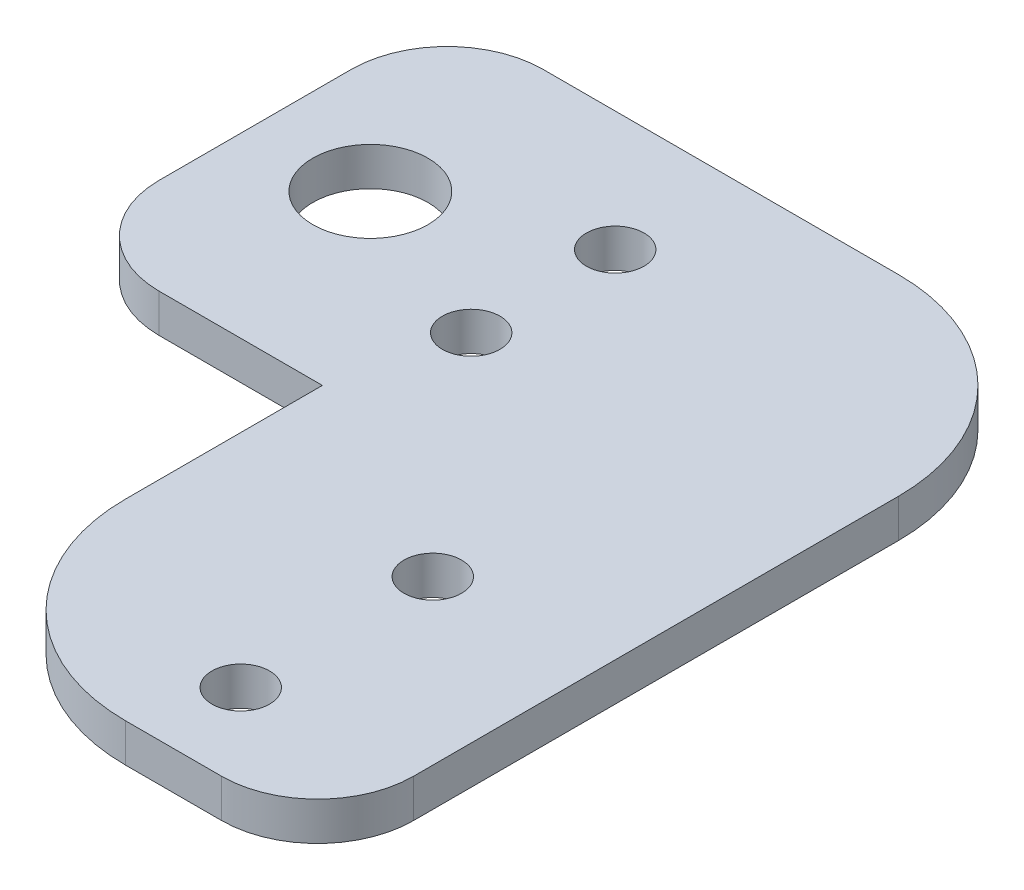
ISO-10303-21;
HEADER;
FILE_DESCRIPTION(('STEP AP214'),'2;1');
FILE_NAME('part.step','',(''),(''),'','','');
FILE_SCHEMA(('AUTOMOTIVE_DESIGN { 1 0 10303 214 1 1 1 1 }'));
ENDSEC;
DATA;
#1=APPLICATION_CONTEXT('core data for automotive mechanical design processes');
#2=APPLICATION_PROTOCOL_DEFINITION('international standard','automotive_design',2000,#1);
#3=PRODUCT_CONTEXT('',#1,'mechanical');
#4=PRODUCT('Part','Part','',(#3));
#5=PRODUCT_RELATED_PRODUCT_CATEGORY('part','',(#4));
#6=PRODUCT_DEFINITION_FORMATION('','',#4);
#7=PRODUCT_DEFINITION_CONTEXT('part definition',#1,'design');
#8=PRODUCT_DEFINITION('design','',#6,#7);
#9=PRODUCT_DEFINITION_SHAPE('','',#8);
#10=(LENGTH_UNIT() NAMED_UNIT(*) SI_UNIT(.MILLI.,.METRE.));
#11=(NAMED_UNIT(*) PLANE_ANGLE_UNIT() SI_UNIT($,.RADIAN.));
#12=(NAMED_UNIT(*) SI_UNIT($,.STERADIAN.) SOLID_ANGLE_UNIT());
#13=UNCERTAINTY_MEASURE_WITH_UNIT(LENGTH_MEASURE(1.E-05),#10,'distance_accuracy_value','');
#14=(GEOMETRIC_REPRESENTATION_CONTEXT(3) GLOBAL_UNCERTAINTY_ASSIGNED_CONTEXT((#13)) GLOBAL_UNIT_ASSIGNED_CONTEXT((#10,
#11,#12)) REPRESENTATION_CONTEXT('',''));
#15=CARTESIAN_POINT('',(0.,0.,0.));
#16=DIRECTION('',(0.,0.,1.));
#17=DIRECTION('',(1.,0.,0.));
#18=AXIS2_PLACEMENT_3D('',#15,#16,#17);
#19=CARTESIAN_POINT('',(-12.5,2.,-10.));
#20=DIRECTION('',(0.,0.,1.));
#21=DIRECTION('',(1.,0.,0.));
#22=AXIS2_PLACEMENT_3D('',#19,#20,#21);
#23=PLANE('',#22);
#24=DIRECTION('',(-1.,0.,0.));
#25=VECTOR('',#24,1.);
#26=CARTESIAN_POINT('',(-12.5,0.,-10.));
#27=LINE('',#26,#25);
#28=CARTESIAN_POINT('',(11.,0.,-10.));
#29=VERTEX_POINT('',#28);
#30=CARTESIAN_POINT('',(-7.5,0.,-10.));
#31=VERTEX_POINT('',#30);
#32=EDGE_CURVE('E180',#29,#31,#27,.T.);
#33=ORIENTED_EDGE('',*,*,#32,.T.);
#34=DIRECTION('',(0.,-1.,0.));
#35=VECTOR('',#34,1.);
#36=CARTESIAN_POINT('',(-7.5,2.,-10.));
#37=LINE('',#36,#35);
#38=CARTESIAN_POINT('',(-7.5,2.,-10.));
#39=VERTEX_POINT('',#38);
#40=EDGE_CURVE('E241',#31,#39,#37,.F.);
#41=ORIENTED_EDGE('',*,*,#40,.T.);
#42=DIRECTION('',(-1.,0.,0.));
#43=VECTOR('',#42,1.);
#44=CARTESIAN_POINT('',(-12.5,2.,-10.));
#45=LINE('',#44,#43);
#46=CARTESIAN_POINT('',(11.,2.,-10.));
#47=VERTEX_POINT('',#46);
#48=EDGE_CURVE('E187',#47,#39,#45,.T.);
#49=ORIENTED_EDGE('',*,*,#48,.F.);
#50=DIRECTION('',(0.,1.,0.));
#51=VECTOR('',#50,1.);
#52=CARTESIAN_POINT('',(11.,0.,-10.));
#53=LINE('',#52,#51);
#54=EDGE_CURVE('E210',#47,#29,#53,.F.);
#55=ORIENTED_EDGE('',*,*,#54,.T.);
#56=EDGE_LOOP('',(#33,#41,#49,#55));
#57=FACE_BOUND('',#56,.T.);
#58=ADVANCED_FACE('F39',(#57),#23,.F.);
#59=CARTESIAN_POINT('',(-12.5,2.,-10.));
#60=DIRECTION('',(1.,0.,0.));
#61=DIRECTION('',(0.,0.,-1.));
#62=AXIS2_PLACEMENT_3D('',#59,#60,#61);
#63=PLANE('',#62);
#64=DIRECTION('',(0.,0.,1.));
#65=VECTOR('',#64,1.);
#66=CARTESIAN_POINT('',(-12.5,2.,-10.));
#67=LINE('',#66,#65);
#68=CARTESIAN_POINT('',(-12.5,2.,-5.));
#69=VERTEX_POINT('',#68);
#70=CARTESIAN_POINT('',(-12.5,2.,5.));
#71=VERTEX_POINT('',#70);
#72=EDGE_CURVE('E134',#69,#71,#67,.T.);
#73=ORIENTED_EDGE('',*,*,#72,.F.);
#74=DIRECTION('',(0.,-1.,0.));
#75=VECTOR('',#74,1.);
#76=CARTESIAN_POINT('',(-12.5,2.,-5.));
#77=LINE('',#76,#75);
#78=CARTESIAN_POINT('',(-12.5,0.,-5.));
#79=VERTEX_POINT('',#78);
#80=EDGE_CURVE('E228',#69,#79,#77,.T.);
#81=ORIENTED_EDGE('',*,*,#80,.T.);
#82=DIRECTION('',(0.,0.,1.));
#83=VECTOR('',#82,1.);
#84=CARTESIAN_POINT('',(-12.5,0.,-10.));
#85=LINE('',#84,#83);
#86=CARTESIAN_POINT('',(-12.5,0.,5.));
#87=VERTEX_POINT('',#86);
#88=EDGE_CURVE('E195',#79,#87,#85,.T.);
#89=ORIENTED_EDGE('',*,*,#88,.T.);
#90=DIRECTION('',(0.,-1.,0.));
#91=VECTOR('',#90,1.);
#92=CARTESIAN_POINT('',(-12.5,2.,5.));
#93=LINE('',#92,#91);
#94=EDGE_CURVE('E225',#87,#71,#93,.F.);
#95=ORIENTED_EDGE('',*,*,#94,.T.);
#96=EDGE_LOOP('',(#73,#81,#89,#95));
#97=FACE_BOUND('',#96,.T.);
#98=ADVANCED_FACE('F328',(#97),#63,.F.);
#99=CARTESIAN_POINT('',(-12.5,2.,10.));
#100=DIRECTION('',(0.,0.,-1.));
#101=DIRECTION('',(-1.,0.,0.));
#102=AXIS2_PLACEMENT_3D('',#99,#100,#101);
#103=PLANE('',#102);
#104=DIRECTION('',(1.,0.,0.));
#105=VECTOR('',#104,1.);
#106=CARTESIAN_POINT('',(-12.5,2.,10.));
#107=LINE('',#106,#105);
#108=CARTESIAN_POINT('',(-7.5,2.,10.));
#109=VERTEX_POINT('',#108);
#110=CARTESIAN_POINT('',(0.999999999999997,2.,10.));
#111=VERTEX_POINT('',#110);
#112=EDGE_CURVE('E122',#109,#111,#107,.T.);
#113=ORIENTED_EDGE('',*,*,#112,.F.);
#114=DIRECTION('',(0.,-1.,0.));
#115=VECTOR('',#114,1.);
#116=CARTESIAN_POINT('',(-7.5,2.,10.));
#117=LINE('',#116,#115);
#118=CARTESIAN_POINT('',(-7.5,0.,10.));
#119=VERTEX_POINT('',#118);
#120=EDGE_CURVE('E251',#109,#119,#117,.T.);
#121=ORIENTED_EDGE('',*,*,#120,.T.);
#122=DIRECTION('',(1.,0.,0.));
#123=VECTOR('',#122,1.);
#124=CARTESIAN_POINT('',(-12.5,0.,10.));
#125=LINE('',#124,#123);
#126=CARTESIAN_POINT('',(0.999999999999997,0.,10.));
#127=VERTEX_POINT('',#126);
#128=EDGE_CURVE('E151',#119,#127,#125,.T.);
#129=ORIENTED_EDGE('',*,*,#128,.T.);
#130=DIRECTION('',(0.,1.,0.));
#131=VECTOR('',#130,1.);
#132=CARTESIAN_POINT('',(0.999999999999997,2.,10.));
#133=LINE('',#132,#131);
#134=EDGE_CURVE('E141',#127,#111,#133,.T.);
#135=ORIENTED_EDGE('',*,*,#134,.T.);
#136=EDGE_LOOP('',(#113,#121,#129,#135));
#137=FACE_BOUND('',#136,.T.);
#138=ADVANCED_FACE('F149',(#137),#103,.F.);
#139=CARTESIAN_POINT('',(0.,2.,0.));
#140=DIRECTION('',(0.,1.,0.));
#141=DIRECTION('',(0.,0.,1.));
#142=AXIS2_PLACEMENT_3D('',#139,#140,#141);
#143=PLANE('',#142);
#144=ORIENTED_EDGE('',*,*,#48,.T.);
#145=CARTESIAN_POINT('',(-7.5,2.,-5.));
#146=DIRECTION('',(0.,1.,0.));
#147=DIRECTION('',(0.,0.,1.));
#148=AXIS2_PLACEMENT_3D('',#145,#146,#147);
#149=CIRCLE('',#148,5.);
#150=EDGE_CURVE('E248',#39,#69,#149,.T.);
#151=ORIENTED_EDGE('',*,*,#150,.T.);
#152=ORIENTED_EDGE('',*,*,#72,.T.);
#153=CARTESIAN_POINT('',(-7.5,2.,5.));
#154=DIRECTION('',(0.,1.,0.));
#155=DIRECTION('',(0.,0.,1.));
#156=AXIS2_PLACEMENT_3D('',#153,#154,#155);
#157=CIRCLE('',#156,5.);
#158=EDGE_CURVE('E63',#71,#109,#157,.T.);
#159=ORIENTED_EDGE('',*,*,#158,.T.);
#160=ORIENTED_EDGE('',*,*,#112,.T.);
#161=DIRECTION('',(0.,0.,1.));
#162=VECTOR('',#161,1.);
#163=CARTESIAN_POINT('',(0.999999999999998,2.,30.25));
#164=LINE('',#163,#162);
#165=CARTESIAN_POINT('',(0.999999999999998,2.,20.25));
#166=VERTEX_POINT('',#165);
#167=EDGE_CURVE('E127',#111,#166,#164,.T.);
#168=ORIENTED_EDGE('',*,*,#167,.T.);
#169=CARTESIAN_POINT('',(11.,2.,20.25));
#170=DIRECTION('',(0.,1.,0.));
#171=DIRECTION('',(0.,0.,1.));
#172=AXIS2_PLACEMENT_3D('',#169,#170,#171);
#173=CIRCLE('',#172,10.);
#174=CARTESIAN_POINT('',(11.,2.,30.25));
#175=VERTEX_POINT('',#174);
#176=EDGE_CURVE('E204',#166,#175,#173,.T.);
#177=ORIENTED_EDGE('',*,*,#176,.T.);
#178=DIRECTION('',(1.,0.,0.));
#179=VECTOR('',#178,1.);
#180=CARTESIAN_POINT('',(21.,2.,30.25));
#181=LINE('',#180,#179);
#182=CARTESIAN_POINT('',(16.,2.,30.25));
#183=VERTEX_POINT('',#182);
#184=EDGE_CURVE('E146',#175,#183,#181,.T.);
#185=ORIENTED_EDGE('',*,*,#184,.T.);
#186=CARTESIAN_POINT('',(16.,2.,25.25));
#187=DIRECTION('',(0.,1.,0.));
#188=DIRECTION('',(0.,0.,1.));
#189=AXIS2_PLACEMENT_3D('',#186,#187,#188);
#190=CIRCLE('',#189,5.);
#191=CARTESIAN_POINT('',(21.,2.,25.25));
#192=VERTEX_POINT('',#191);
#193=EDGE_CURVE('E55',#183,#192,#190,.T.);
#194=ORIENTED_EDGE('',*,*,#193,.T.);
#195=DIRECTION('',(0.,0.,-1.));
#196=VECTOR('',#195,1.);
#197=CARTESIAN_POINT('',(21.,2.,30.25));
#198=LINE('',#197,#196);
#199=CARTESIAN_POINT('',(21.,2.,0.));
#200=VERTEX_POINT('',#199);
#201=EDGE_CURVE('E165',#192,#200,#198,.T.);
#202=ORIENTED_EDGE('',*,*,#201,.T.);
#203=CARTESIAN_POINT('',(11.,2.,0.));
#204=DIRECTION('',(0.,1.,0.));
#205=DIRECTION('',(0.,0.,1.));
#206=AXIS2_PLACEMENT_3D('',#203,#204,#205);
#207=CIRCLE('',#206,10.);
#208=EDGE_CURVE('E207',#200,#47,#207,.T.);
#209=ORIENTED_EDGE('',*,*,#208,.T.);
#210=EDGE_LOOP('',(#144,#151,#152,#159,#160,#168,#177,#185,#194,#202,#209));
#211=FACE_BOUND('',#210,.T.);
#212=CARTESIAN_POINT('',(12.5,2.,15.75));
#213=DIRECTION('',(0.,1.,0.));
#214=DIRECTION('',(0.,0.,1.));
#215=AXIS2_PLACEMENT_3D('',#212,#213,#214);
#216=CIRCLE('',#215,1.5);
#217=CARTESIAN_POINT('',(12.5,2.,17.25));
#218=VERTEX_POINT('',#217);
#219=EDGE_CURVE('E279',#218,#218,#216,.T.);
#220=ORIENTED_EDGE('',*,*,#219,.F.);
#221=EDGE_LOOP('',(#220));
#222=FACE_BOUND('',#221,.T.);
#223=CARTESIAN_POINT('',(12.5,2.,25.75));
#224=DIRECTION('',(0.,1.,0.));
#225=DIRECTION('',(0.,0.,1.));
#226=AXIS2_PLACEMENT_3D('',#223,#224,#225);
#227=CIRCLE('',#226,1.5);
#228=CARTESIAN_POINT('',(12.5,2.,27.25));
#229=VERTEX_POINT('',#228);
#230=EDGE_CURVE('E271',#229,#229,#227,.T.);
#231=ORIENTED_EDGE('',*,*,#230,.F.);
#232=EDGE_LOOP('',(#231));
#233=FACE_BOUND('',#232,.T.);
#234=CARTESIAN_POINT('',(2.5,2.,3.75));
#235=DIRECTION('',(0.,1.,0.));
#236=DIRECTION('',(0.,0.,1.));
#237=AXIS2_PLACEMENT_3D('',#234,#235,#236);
#238=CIRCLE('',#237,1.5);
#239=CARTESIAN_POINT('',(2.5,2.,5.25));
#240=VERTEX_POINT('',#239);
#241=EDGE_CURVE('E169',#240,#240,#238,.T.);
#242=ORIENTED_EDGE('',*,*,#241,.F.);
#243=EDGE_LOOP('',(#242));
#244=FACE_BOUND('',#243,.T.);
#245=CARTESIAN_POINT('',(-6.5,2.,0.));
#246=DIRECTION('',(0.,1.,0.));
#247=DIRECTION('',(0.,0.,1.));
#248=AXIS2_PLACEMENT_3D('',#245,#246,#247);
#249=CIRCLE('',#248,3.);
#250=CARTESIAN_POINT('',(-6.5,2.,3.));
#251=VERTEX_POINT('',#250);
#252=EDGE_CURVE('E153',#251,#251,#249,.F.);
#253=ORIENTED_EDGE('',*,*,#252,.T.);
#254=EDGE_LOOP('',(#253));
#255=FACE_BOUND('',#254,.T.);
#256=CARTESIAN_POINT('',(2.5,2.,-3.75));
#257=DIRECTION('',(0.,1.,0.));
#258=DIRECTION('',(0.,0.,1.));
#259=AXIS2_PLACEMENT_3D('',#256,#257,#258);
#260=CIRCLE('',#259,1.5);
#261=CARTESIAN_POINT('',(2.5,2.,-2.25));
#262=VERTEX_POINT('',#261);
#263=EDGE_CURVE('E171',#262,#262,#260,.T.);
#264=ORIENTED_EDGE('',*,*,#263,.F.);
#265=EDGE_LOOP('',(#264));
#266=FACE_BOUND('',#265,.T.);
#267=ADVANCED_FACE('F125',(#211,#222,#233,#244,#255,#266),#143,.T.);
#268=CARTESIAN_POINT('',(0.,0.,0.));
#269=DIRECTION('',(0.,1.,0.));
#270=DIRECTION('',(0.,0.,1.));
#271=AXIS2_PLACEMENT_3D('',#268,#269,#270);
#272=PLANE('',#271);
#273=ORIENTED_EDGE('',*,*,#88,.F.);
#274=CARTESIAN_POINT('',(-7.5,0.,-5.));
#275=DIRECTION('',(0.,1.,0.));
#276=DIRECTION('',(0.,0.,1.));
#277=AXIS2_PLACEMENT_3D('',#274,#275,#276);
#278=CIRCLE('',#277,5.);
#279=EDGE_CURVE('E238',#79,#31,#278,.F.);
#280=ORIENTED_EDGE('',*,*,#279,.T.);
#281=ORIENTED_EDGE('',*,*,#32,.F.);
#282=CARTESIAN_POINT('',(11.,0.,0.));
#283=DIRECTION('',(0.,1.,0.));
#284=DIRECTION('',(0.,0.,1.));
#285=AXIS2_PLACEMENT_3D('',#282,#283,#284);
#286=CIRCLE('',#285,10.);
#287=CARTESIAN_POINT('',(21.,0.,0.));
#288=VERTEX_POINT('',#287);
#289=EDGE_CURVE('E216',#29,#288,#286,.F.);
#290=ORIENTED_EDGE('',*,*,#289,.T.);
#291=DIRECTION('',(0.,0.,-1.));
#292=VECTOR('',#291,1.);
#293=CARTESIAN_POINT('',(21.,0.,30.25));
#294=LINE('',#293,#292);
#295=CARTESIAN_POINT('',(21.,0.,25.25));
#296=VERTEX_POINT('',#295);
#297=EDGE_CURVE('E154',#296,#288,#294,.T.);
#298=ORIENTED_EDGE('',*,*,#297,.F.);
#299=CARTESIAN_POINT('',(16.,0.,25.25));
#300=DIRECTION('',(0.,1.,0.));
#301=DIRECTION('',(0.,0.,1.));
#302=AXIS2_PLACEMENT_3D('',#299,#300,#301);
#303=CIRCLE('',#302,5.);
#304=CARTESIAN_POINT('',(16.,0.,30.25));
#305=VERTEX_POINT('',#304);
#306=EDGE_CURVE('E232',#296,#305,#303,.F.);
#307=ORIENTED_EDGE('',*,*,#306,.T.);
#308=DIRECTION('',(1.,0.,0.));
#309=VECTOR('',#308,1.);
#310=CARTESIAN_POINT('',(21.,0.,30.25));
#311=LINE('',#310,#309);
#312=CARTESIAN_POINT('',(11.,0.,30.25));
#313=VERTEX_POINT('',#312);
#314=EDGE_CURVE('E161',#313,#305,#311,.T.);
#315=ORIENTED_EDGE('',*,*,#314,.F.);
#316=CARTESIAN_POINT('',(11.,0.,20.25));
#317=DIRECTION('',(0.,1.,0.));
#318=DIRECTION('',(0.,0.,1.));
#319=AXIS2_PLACEMENT_3D('',#316,#317,#318);
#320=CIRCLE('',#319,10.);
#321=CARTESIAN_POINT('',(0.999999999999998,0.,20.25));
#322=VERTEX_POINT('',#321);
#323=EDGE_CURVE('E213',#313,#322,#320,.F.);
#324=ORIENTED_EDGE('',*,*,#323,.T.);
#325=DIRECTION('',(0.,0.,1.));
#326=VECTOR('',#325,1.);
#327=CARTESIAN_POINT('',(0.999999999999998,0.,30.25));
#328=LINE('',#327,#326);
#329=EDGE_CURVE('E265',#127,#322,#328,.T.);
#330=ORIENTED_EDGE('',*,*,#329,.F.);
#331=ORIENTED_EDGE('',*,*,#128,.F.);
#332=CARTESIAN_POINT('',(-7.5,0.,5.));
#333=DIRECTION('',(0.,1.,0.));
#334=DIRECTION('',(0.,0.,1.));
#335=AXIS2_PLACEMENT_3D('',#332,#333,#334);
#336=CIRCLE('',#335,5.);
#337=EDGE_CURVE('E235',#119,#87,#336,.F.);
#338=ORIENTED_EDGE('',*,*,#337,.T.);
#339=EDGE_LOOP('',(#273,#280,#281,#290,#298,#307,#315,#324,#330,#331,#338));
#340=FACE_BOUND('',#339,.T.);
#341=CARTESIAN_POINT('',(12.5,0.,15.75));
#342=DIRECTION('',(0.,1.,0.));
#343=DIRECTION('',(0.,0.,1.));
#344=AXIS2_PLACEMENT_3D('',#341,#342,#343);
#345=CIRCLE('',#344,1.5);
#346=CARTESIAN_POINT('',(12.5,0.,17.25));
#347=VERTEX_POINT('',#346);
#348=EDGE_CURVE('E147',#347,#347,#345,.T.);
#349=ORIENTED_EDGE('',*,*,#348,.T.);
#350=EDGE_LOOP('',(#349));
#351=FACE_BOUND('',#350,.T.);
#352=CARTESIAN_POINT('',(12.5,0.,25.75));
#353=DIRECTION('',(0.,1.,0.));
#354=DIRECTION('',(0.,0.,1.));
#355=AXIS2_PLACEMENT_3D('',#352,#353,#354);
#356=CIRCLE('',#355,1.5);
#357=CARTESIAN_POINT('',(12.5,0.,27.25));
#358=VERTEX_POINT('',#357);
#359=EDGE_CURVE('E275',#358,#358,#356,.T.);
#360=ORIENTED_EDGE('',*,*,#359,.T.);
#361=EDGE_LOOP('',(#360));
#362=FACE_BOUND('',#361,.T.);
#363=CARTESIAN_POINT('',(2.5,0.,3.75));
#364=DIRECTION('',(0.,1.,0.));
#365=DIRECTION('',(0.,0.,1.));
#366=AXIS2_PLACEMENT_3D('',#363,#364,#365);
#367=CIRCLE('',#366,1.5);
#368=CARTESIAN_POINT('',(2.5,0.,5.25));
#369=VERTEX_POINT('',#368);
#370=EDGE_CURVE('E176',#369,#369,#367,.F.);
#371=ORIENTED_EDGE('',*,*,#370,.F.);
#372=EDGE_LOOP('',(#371));
#373=FACE_BOUND('',#372,.T.);
#374=CARTESIAN_POINT('',(-6.5,0.,0.));
#375=DIRECTION('',(0.,-1.,0.));
#376=DIRECTION('',(0.,0.,-1.));
#377=AXIS2_PLACEMENT_3D('',#374,#375,#376);
#378=CIRCLE('',#377,3.);
#379=CARTESIAN_POINT('',(-6.5,0.,-3.));
#380=VERTEX_POINT('',#379);
#381=EDGE_CURVE('E159',#380,#380,#378,.T.);
#382=ORIENTED_EDGE('',*,*,#381,.F.);
#383=EDGE_LOOP('',(#382));
#384=FACE_BOUND('',#383,.T.);
#385=CARTESIAN_POINT('',(2.5,0.,-3.75));
#386=DIRECTION('',(0.,1.,0.));
#387=DIRECTION('',(0.,0.,1.));
#388=AXIS2_PLACEMENT_3D('',#385,#386,#387);
#389=CIRCLE('',#388,1.5);
#390=CARTESIAN_POINT('',(2.5,0.,-2.25));
#391=VERTEX_POINT('',#390);
#392=EDGE_CURVE('E175',#391,#391,#389,.F.);
#393=ORIENTED_EDGE('',*,*,#392,.F.);
#394=EDGE_LOOP('',(#393));
#395=FACE_BOUND('',#394,.T.);
#396=ADVANCED_FACE('F287',(#340,#351,#362,#373,#384,#395),#272,.F.);
#397=CARTESIAN_POINT('',(2.5,-0.00100000000000013,3.75));
#398=DIRECTION('',(0.,1.,0.));
#399=DIRECTION('',(0.,0.,1.));
#400=AXIS2_PLACEMENT_3D('',#397,#398,#399);
#401=CYLINDRICAL_SURFACE('',#400,1.5);
#402=ORIENTED_EDGE('',*,*,#370,.T.);
#403=EDGE_LOOP('',(#402));
#404=FACE_BOUND('',#403,.T.);
#405=ORIENTED_EDGE('',*,*,#241,.T.);
#406=EDGE_LOOP('',(#405));
#407=FACE_BOUND('',#406,.T.);
#408=ADVANCED_FACE('F312',(#404,#407),#401,.F.);
#409=CARTESIAN_POINT('',(2.5,-0.00100000000000013,-3.75));
#410=DIRECTION('',(0.,1.,0.));
#411=DIRECTION('',(0.,0.,1.));
#412=AXIS2_PLACEMENT_3D('',#409,#410,#411);
#413=CYLINDRICAL_SURFACE('',#412,1.5);
#414=ORIENTED_EDGE('',*,*,#263,.T.);
#415=EDGE_LOOP('',(#414));
#416=FACE_BOUND('',#415,.T.);
#417=ORIENTED_EDGE('',*,*,#392,.T.);
#418=EDGE_LOOP('',(#417));
#419=FACE_BOUND('',#418,.T.);
#420=ADVANCED_FACE('F308',(#416,#419),#413,.F.);
#421=CARTESIAN_POINT('',(-6.5,2.001,0.));
#422=DIRECTION('',(0.,-1.,0.));
#423=DIRECTION('',(0.,0.,-1.));
#424=AXIS2_PLACEMENT_3D('',#421,#422,#423);
#425=CYLINDRICAL_SURFACE('',#424,3.);
#426=ORIENTED_EDGE('',*,*,#252,.F.);
#427=EDGE_LOOP('',(#426));
#428=FACE_BOUND('',#427,.T.);
#429=ORIENTED_EDGE('',*,*,#381,.T.);
#430=EDGE_LOOP('',(#429));
#431=FACE_BOUND('',#430,.T.);
#432=ADVANCED_FACE('F311',(#428,#431),#425,.F.);
#433=CARTESIAN_POINT('',(0.999999999999998,0.,30.25));
#434=DIRECTION('',(-1.,0.,0.));
#435=DIRECTION('',(0.,0.,1.));
#436=AXIS2_PLACEMENT_3D('',#433,#434,#435);
#437=PLANE('',#436);
#438=ORIENTED_EDGE('',*,*,#329,.T.);
#439=DIRECTION('',(0.,1.,0.));
#440=VECTOR('',#439,1.);
#441=CARTESIAN_POINT('',(0.999999999999998,0.,20.25));
#442=LINE('',#441,#440);
#443=EDGE_CURVE('E144',#322,#166,#442,.T.);
#444=ORIENTED_EDGE('',*,*,#443,.T.);
#445=ORIENTED_EDGE('',*,*,#167,.F.);
#446=ORIENTED_EDGE('',*,*,#134,.F.);
#447=EDGE_LOOP('',(#438,#444,#445,#446));
#448=FACE_BOUND('',#447,.T.);
#449=ADVANCED_FACE('F140',(#448),#437,.T.);
#450=CARTESIAN_POINT('',(21.,0.,30.25));
#451=DIRECTION('',(1.,0.,0.));
#452=DIRECTION('',(0.,0.,-1.));
#453=AXIS2_PLACEMENT_3D('',#450,#451,#452);
#454=PLANE('',#453);
#455=ORIENTED_EDGE('',*,*,#201,.F.);
#456=DIRECTION('',(0.,1.,0.));
#457=VECTOR('',#456,1.);
#458=CARTESIAN_POINT('',(21.,0.,25.25));
#459=LINE('',#458,#457);
#460=EDGE_CURVE('E11',#192,#296,#459,.F.);
#461=ORIENTED_EDGE('',*,*,#460,.T.);
#462=ORIENTED_EDGE('',*,*,#297,.T.);
#463=DIRECTION('',(0.,1.,0.));
#464=VECTOR('',#463,1.);
#465=CARTESIAN_POINT('',(21.,2.,0.));
#466=LINE('',#465,#464);
#467=EDGE_CURVE('E133',#288,#200,#466,.T.);
#468=ORIENTED_EDGE('',*,*,#467,.T.);
#469=EDGE_LOOP('',(#455,#461,#462,#468));
#470=FACE_BOUND('',#469,.T.);
#471=ADVANCED_FACE('F358',(#470),#454,.T.);
#472=CARTESIAN_POINT('',(21.,0.,30.25));
#473=DIRECTION('',(0.,0.,1.));
#474=DIRECTION('',(1.,0.,0.));
#475=AXIS2_PLACEMENT_3D('',#472,#473,#474);
#476=PLANE('',#475);
#477=ORIENTED_EDGE('',*,*,#314,.T.);
#478=DIRECTION('',(0.,1.,0.));
#479=VECTOR('',#478,1.);
#480=CARTESIAN_POINT('',(16.,0.,30.25));
#481=LINE('',#480,#479);
#482=EDGE_CURVE('E48',#305,#183,#481,.T.);
#483=ORIENTED_EDGE('',*,*,#482,.T.);
#484=ORIENTED_EDGE('',*,*,#184,.F.);
#485=DIRECTION('',(0.,1.,0.));
#486=VECTOR('',#485,1.);
#487=CARTESIAN_POINT('',(11.,0.,30.25));
#488=LINE('',#487,#486);
#489=EDGE_CURVE('E222',#175,#313,#488,.F.);
#490=ORIENTED_EDGE('',*,*,#489,.T.);
#491=EDGE_LOOP('',(#477,#483,#484,#490));
#492=FACE_BOUND('',#491,.T.);
#493=ADVANCED_FACE('F258',(#492),#476,.T.);
#494=CARTESIAN_POINT('',(12.5,0.,25.75));
#495=DIRECTION('',(0.,1.,0.));
#496=DIRECTION('',(0.,0.,1.));
#497=AXIS2_PLACEMENT_3D('',#494,#495,#496);
#498=CYLINDRICAL_SURFACE('',#497,1.5);
#499=ORIENTED_EDGE('',*,*,#359,.F.);
#500=EDGE_LOOP('',(#499));
#501=FACE_BOUND('',#500,.T.);
#502=ORIENTED_EDGE('',*,*,#230,.T.);
#503=EDGE_LOOP('',(#502));
#504=FACE_BOUND('',#503,.T.);
#505=ADVANCED_FACE('F294',(#501,#504),#498,.F.);
#506=CARTESIAN_POINT('',(12.5,0.,15.75));
#507=DIRECTION('',(0.,1.,0.));
#508=DIRECTION('',(0.,0.,1.));
#509=AXIS2_PLACEMENT_3D('',#506,#507,#508);
#510=CYLINDRICAL_SURFACE('',#509,1.5);
#511=ORIENTED_EDGE('',*,*,#348,.F.);
#512=EDGE_LOOP('',(#511));
#513=FACE_BOUND('',#512,.T.);
#514=ORIENTED_EDGE('',*,*,#219,.T.);
#515=EDGE_LOOP('',(#514));
#516=FACE_BOUND('',#515,.T.);
#517=ADVANCED_FACE('F290',(#513,#516),#510,.F.);
#518=CARTESIAN_POINT('',(11.,0.,0.));
#519=DIRECTION('',(0.,-1.,0.));
#520=DIRECTION('',(0.,0.,-1.));
#521=AXIS2_PLACEMENT_3D('',#518,#519,#520);
#522=CYLINDRICAL_SURFACE('',#521,10.);
#523=ORIENTED_EDGE('',*,*,#289,.F.);
#524=ORIENTED_EDGE('',*,*,#54,.F.);
#525=ORIENTED_EDGE('',*,*,#208,.F.);
#526=ORIENTED_EDGE('',*,*,#467,.F.);
#527=EDGE_LOOP('',(#523,#524,#525,#526));
#528=FACE_BOUND('',#527,.T.);
#529=ADVANCED_FACE('F293',(#528),#522,.T.);
#530=CARTESIAN_POINT('',(11.,0.,20.25));
#531=DIRECTION('',(0.,1.,0.));
#532=DIRECTION('',(0.,0.,1.));
#533=AXIS2_PLACEMENT_3D('',#530,#531,#532);
#534=CYLINDRICAL_SURFACE('',#533,10.);
#535=ORIENTED_EDGE('',*,*,#323,.F.);
#536=ORIENTED_EDGE('',*,*,#489,.F.);
#537=ORIENTED_EDGE('',*,*,#176,.F.);
#538=ORIENTED_EDGE('',*,*,#443,.F.);
#539=EDGE_LOOP('',(#535,#536,#537,#538));
#540=FACE_BOUND('',#539,.T.);
#541=ADVANCED_FACE('F340',(#540),#534,.T.);
#542=CARTESIAN_POINT('',(-7.5,2.,-5.));
#543=DIRECTION('',(0.,-1.,0.));
#544=DIRECTION('',(0.,0.,-1.));
#545=AXIS2_PLACEMENT_3D('',#542,#543,#544);
#546=CYLINDRICAL_SURFACE('',#545,5.);
#547=ORIENTED_EDGE('',*,*,#150,.F.);
#548=ORIENTED_EDGE('',*,*,#40,.F.);
#549=ORIENTED_EDGE('',*,*,#279,.F.);
#550=ORIENTED_EDGE('',*,*,#80,.F.);
#551=EDGE_LOOP('',(#547,#548,#549,#550));
#552=FACE_BOUND('',#551,.T.);
#553=ADVANCED_FACE('F344',(#552),#546,.T.);
#554=CARTESIAN_POINT('',(-7.5,2.,5.));
#555=DIRECTION('',(0.,-1.,0.));
#556=DIRECTION('',(0.,0.,-1.));
#557=AXIS2_PLACEMENT_3D('',#554,#555,#556);
#558=CYLINDRICAL_SURFACE('',#557,5.);
#559=ORIENTED_EDGE('',*,*,#158,.F.);
#560=ORIENTED_EDGE('',*,*,#94,.F.);
#561=ORIENTED_EDGE('',*,*,#337,.F.);
#562=ORIENTED_EDGE('',*,*,#120,.F.);
#563=EDGE_LOOP('',(#559,#560,#561,#562));
#564=FACE_BOUND('',#563,.T.);
#565=ADVANCED_FACE('F347',(#564),#558,.T.);
#566=CARTESIAN_POINT('',(16.,0.,25.25));
#567=DIRECTION('',(0.,1.,0.));
#568=DIRECTION('',(0.,0.,1.));
#569=AXIS2_PLACEMENT_3D('',#566,#567,#568);
#570=CYLINDRICAL_SURFACE('',#569,5.);
#571=ORIENTED_EDGE('',*,*,#306,.F.);
#572=ORIENTED_EDGE('',*,*,#460,.F.);
#573=ORIENTED_EDGE('',*,*,#193,.F.);
#574=ORIENTED_EDGE('',*,*,#482,.F.);
#575=EDGE_LOOP('',(#571,#572,#573,#574));
#576=FACE_BOUND('',#575,.T.);
#577=ADVANCED_FACE('F41',(#576),#570,.T.);
#578=CLOSED_SHELL('',(#58,#98,#138,#267,#396,#408,#420,#432,#449,#471,#493,#505,#517,#529,#541,
#553,#565,#577));
#579=MANIFOLD_SOLID_BREP('B2',#578);
#580=ADVANCED_BREP_SHAPE_REPRESENTATION('',(#18,#579),#14);
#581=SHAPE_DEFINITION_REPRESENTATION(#9,#580);
ENDSEC;
END-ISO-10303-21;
